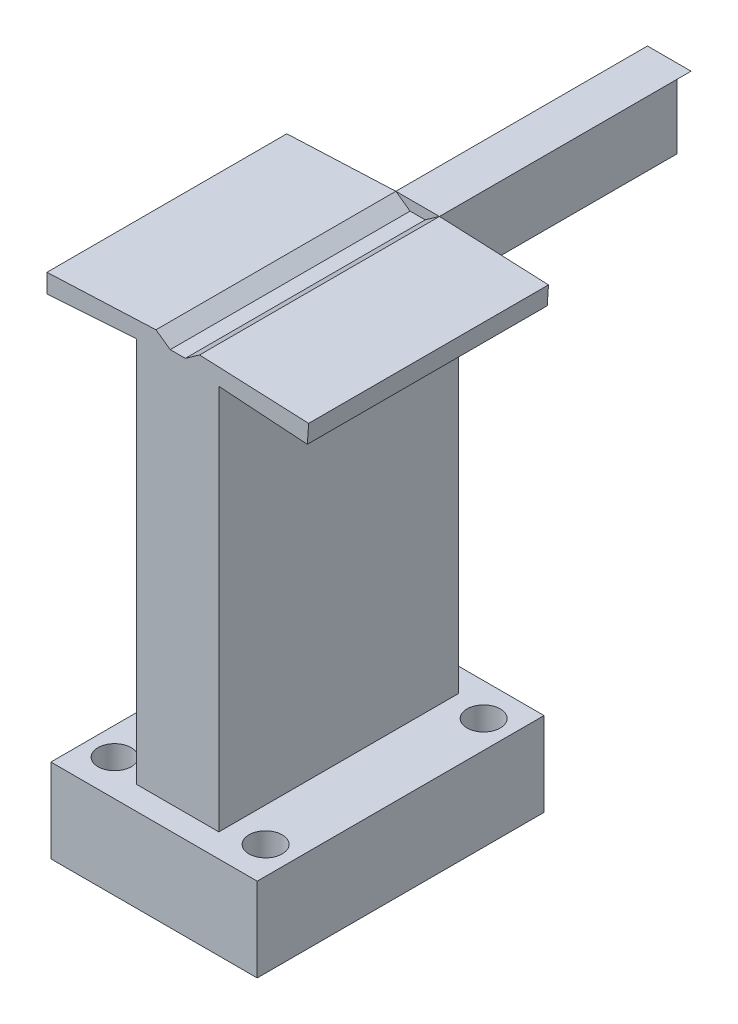
ISO-10303-21;
HEADER;
FILE_DESCRIPTION(('STEP AP214'),'2;1');
FILE_NAME('part.step','',(''),(''),'','','');
FILE_SCHEMA(('AUTOMOTIVE_DESIGN { 1 0 10303 214 1 1 1 1 }'));
ENDSEC;
DATA;
#1=APPLICATION_CONTEXT('core data for automotive mechanical design processes');
#2=APPLICATION_PROTOCOL_DEFINITION('international standard','automotive_design',2000,#1);
#3=PRODUCT_CONTEXT('',#1,'mechanical');
#4=PRODUCT('Part','Part','',(#3));
#5=PRODUCT_RELATED_PRODUCT_CATEGORY('part','',(#4));
#6=PRODUCT_DEFINITION_FORMATION('','',#4);
#7=PRODUCT_DEFINITION_CONTEXT('part definition',#1,'design');
#8=PRODUCT_DEFINITION('design','',#6,#7);
#9=PRODUCT_DEFINITION_SHAPE('','',#8);
#10=(LENGTH_UNIT() NAMED_UNIT(*) SI_UNIT(.MILLI.,.METRE.));
#11=(NAMED_UNIT(*) PLANE_ANGLE_UNIT() SI_UNIT($,.RADIAN.));
#12=(NAMED_UNIT(*) SI_UNIT($,.STERADIAN.) SOLID_ANGLE_UNIT());
#13=UNCERTAINTY_MEASURE_WITH_UNIT(LENGTH_MEASURE(1.E-05),#10,'distance_accuracy_value','');
#14=(GEOMETRIC_REPRESENTATION_CONTEXT(3) GLOBAL_UNCERTAINTY_ASSIGNED_CONTEXT((#13)) GLOBAL_UNIT_ASSIGNED_CONTEXT((#10,
#11,#12)) REPRESENTATION_CONTEXT('',''));
#15=CARTESIAN_POINT('',(0.,0.,0.));
#16=DIRECTION('',(0.,0.,1.));
#17=DIRECTION('',(1.,0.,0.));
#18=AXIS2_PLACEMENT_3D('',#15,#16,#17);
#19=CARTESIAN_POINT('',(-2.286,10.414,74.422));
#20=DIRECTION('',(-0.576683197598655,-0.816967863264762,0.));
#21=DIRECTION('',(0.816967863264762,-0.576683197598654,0.));
#22=AXIS2_PLACEMENT_3D('',#19,#20,#21);
#23=PLANE('',#22);
#24=DIRECTION('',(-0.816967863264762,0.576683197598655,0.));
#25=VECTOR('',#24,1.);
#26=CARTESIAN_POINT('',(-2.286,10.414,38.1));
#27=LINE('',#26,#25);
#28=CARTESIAN_POINT('',(-2.286,10.414,38.1));
#29=VERTEX_POINT('',#28);
#30=CARTESIAN_POINT('',(-4.445,11.938,38.1));
#31=VERTEX_POINT('',#30);
#32=EDGE_CURVE('E192',#29,#31,#27,.T.);
#33=ORIENTED_EDGE('',*,*,#32,.T.);
#34=DIRECTION('',(0.,0.,-1.));
#35=VECTOR('',#34,1.);
#36=CARTESIAN_POINT('',(-4.445,11.938,74.422));
#37=LINE('',#36,#35);
#38=CARTESIAN_POINT('',(-4.445,11.938,74.422));
#39=VERTEX_POINT('',#38);
#40=EDGE_CURVE('E12',#39,#31,#37,.T.);
#41=ORIENTED_EDGE('',*,*,#40,.F.);
#42=DIRECTION('',(-0.816967863264762,0.576683197598655,0.));
#43=VECTOR('',#42,1.);
#44=CARTESIAN_POINT('',(-2.286,10.414,74.422));
#45=LINE('',#44,#43);
#46=CARTESIAN_POINT('',(-2.286,10.414,74.422));
#47=VERTEX_POINT('',#46);
#48=EDGE_CURVE('E235',#47,#39,#45,.T.);
#49=ORIENTED_EDGE('',*,*,#48,.F.);
#50=DIRECTION('',(0.,0.,-1.));
#51=VECTOR('',#50,1.);
#52=CARTESIAN_POINT('',(-2.286,10.414,74.422));
#53=LINE('',#52,#51);
#54=EDGE_CURVE('E188',#47,#29,#53,.T.);
#55=ORIENTED_EDGE('',*,*,#54,.T.);
#56=EDGE_LOOP('',(#33,#41,#49,#55));
#57=FACE_BOUND('',#56,.T.);
#58=ADVANCED_FACE('F53',(#57),#23,.F.);
#59=CARTESIAN_POINT('',(-4.445,11.938,74.422));
#60=DIRECTION('',(0.043270298498433,-0.999063402026046,0.));
#61=DIRECTION('',(0.999063402026046,0.043270298498433,0.));
#62=AXIS2_PLACEMENT_3D('',#59,#60,#61);
#63=PLANE('',#62);
#64=DIRECTION('',(-0.999063402026046,-0.043270298498433,0.));
#65=VECTOR('',#64,1.);
#66=CARTESIAN_POINT('',(-4.445,11.938,38.1));
#67=LINE('',#66,#65);
#68=CARTESIAN_POINT('',(-20.955,11.2229376458387,38.1));
#69=VERTEX_POINT('',#68);
#70=EDGE_CURVE('E196',#31,#69,#67,.T.);
#71=ORIENTED_EDGE('',*,*,#70,.T.);
#72=DIRECTION('',(0.,0.,-1.));
#73=VECTOR('',#72,1.);
#74=CARTESIAN_POINT('',(-20.955,11.2229376458387,74.422));
#75=LINE('',#74,#73);
#76=CARTESIAN_POINT('',(-20.955,11.2229376458387,74.422));
#77=VERTEX_POINT('',#76);
#78=EDGE_CURVE('E63',#77,#69,#75,.T.);
#79=ORIENTED_EDGE('',*,*,#78,.F.);
#80=DIRECTION('',(-0.999063402026046,-0.043270298498433,0.));
#81=VECTOR('',#80,1.);
#82=CARTESIAN_POINT('',(-4.445,11.938,74.422));
#83=LINE('',#82,#81);
#84=EDGE_CURVE('E131',#39,#77,#83,.T.);
#85=ORIENTED_EDGE('',*,*,#84,.F.);
#86=ORIENTED_EDGE('',*,*,#40,.T.);
#87=EDGE_LOOP('',(#71,#79,#85,#86));
#88=FACE_BOUND('',#87,.T.);
#89=ADVANCED_FACE('F419',(#88),#63,.F.);
#90=CARTESIAN_POINT('',(-20.955,11.2229376458387,74.422));
#91=DIRECTION('',(1.,0.,0.));
#92=DIRECTION('',(0.,0.,-1.));
#93=AXIS2_PLACEMENT_3D('',#90,#91,#92);
#94=PLANE('',#93);
#95=DIRECTION('',(0.,-1.,0.));
#96=VECTOR('',#95,1.);
#97=CARTESIAN_POINT('',(-20.955,11.2229376458387,38.1));
#98=LINE('',#97,#96);
#99=CARTESIAN_POINT('',(-20.955,8.36935222492145,38.1));
#100=VERTEX_POINT('',#99);
#101=EDGE_CURVE('E200',#69,#100,#98,.T.);
#102=ORIENTED_EDGE('',*,*,#101,.T.);
#103=DIRECTION('',(0.,0.,-1.));
#104=VECTOR('',#103,1.);
#105=CARTESIAN_POINT('',(-20.955,8.36935222492145,74.422));
#106=LINE('',#105,#104);
#107=CARTESIAN_POINT('',(-20.955,8.36935222492145,74.422));
#108=VERTEX_POINT('',#107);
#109=EDGE_CURVE('E269',#108,#100,#106,.T.);
#110=ORIENTED_EDGE('',*,*,#109,.F.);
#111=DIRECTION('',(0.,-1.,0.));
#112=VECTOR('',#111,1.);
#113=CARTESIAN_POINT('',(-20.955,11.2229376458387,74.422));
#114=LINE('',#113,#112);
#115=EDGE_CURVE('E337',#77,#108,#114,.T.);
#116=ORIENTED_EDGE('',*,*,#115,.F.);
#117=ORIENTED_EDGE('',*,*,#78,.T.);
#118=EDGE_LOOP('',(#102,#110,#116,#117));
#119=FACE_BOUND('',#118,.T.);
#120=ADVANCED_FACE('F424',(#119),#94,.F.);
#121=CARTESIAN_POINT('',(-20.955,8.36935222492145,74.422));
#122=DIRECTION('',(-0.0670937474121484,0.997746675794109,0.));
#123=DIRECTION('',(-0.997746675794109,-0.0670937474121484,0.));
#124=AXIS2_PLACEMENT_3D('',#121,#122,#123);
#125=PLANE('',#124);
#126=DIRECTION('',(0.997746675794109,0.0670937474121484,0.));
#127=VECTOR('',#126,1.);
#128=CARTESIAN_POINT('',(-20.955,8.36935222492145,38.1));
#129=LINE('',#128,#127);
#130=CARTESIAN_POINT('',(-7.45622925128427,9.27708074656047,38.1));
#131=VERTEX_POINT('',#130);
#132=EDGE_CURVE('E203',#100,#131,#129,.T.);
#133=ORIENTED_EDGE('',*,*,#132,.T.);
#134=DIRECTION('',(0.,0.,-1.));
#135=VECTOR('',#134,1.);
#136=CARTESIAN_POINT('',(-7.45622925128427,9.27708074656047,74.422));
#137=LINE('',#136,#135);
#138=CARTESIAN_POINT('',(-7.45622925128427,9.27708074656047,74.422));
#139=VERTEX_POINT('',#138);
#140=EDGE_CURVE('E265',#139,#131,#137,.T.);
#141=ORIENTED_EDGE('',*,*,#140,.F.);
#142=DIRECTION('',(0.997746675794109,0.0670937474121484,0.));
#143=VECTOR('',#142,1.);
#144=CARTESIAN_POINT('',(-20.955,8.36935222492145,74.422));
#145=LINE('',#144,#143);
#146=EDGE_CURVE('E340',#108,#139,#145,.T.);
#147=ORIENTED_EDGE('',*,*,#146,.F.);
#148=ORIENTED_EDGE('',*,*,#109,.T.);
#149=EDGE_LOOP('',(#133,#141,#147,#148));
#150=FACE_BOUND('',#149,.T.);
#151=ADVANCED_FACE('F440',(#150),#125,.F.);
#152=CARTESIAN_POINT('',(-7.45622925128427,9.27708074656047,74.422));
#153=DIRECTION('',(0.69840315219926,0.715704573827873,0.));
#154=DIRECTION('',(-0.715704573827873,0.69840315219926,0.));
#155=AXIS2_PLACEMENT_3D('',#152,#153,#154);
#156=PLANE('',#155);
#157=DIRECTION('',(0.715704573827873,-0.69840315219926,0.));
#158=VECTOR('',#157,1.);
#159=CARTESIAN_POINT('',(-7.45622925128427,9.27708074656047,38.1));
#160=LINE('',#159,#158);
#161=CARTESIAN_POINT('',(-7.366,9.18903269458215,38.1));
#162=VERTEX_POINT('',#161);
#163=EDGE_CURVE('E206',#131,#162,#160,.T.);
#164=ORIENTED_EDGE('',*,*,#163,.T.);
#165=DIRECTION('',(0.,0.,-1.));
#166=VECTOR('',#165,1.);
#167=CARTESIAN_POINT('',(-7.366,9.18903269458215,74.422));
#168=LINE('',#167,#166);
#169=CARTESIAN_POINT('',(-7.366,9.18903269458215,74.422));
#170=VERTEX_POINT('',#169);
#171=EDGE_CURVE('E261',#170,#162,#168,.T.);
#172=ORIENTED_EDGE('',*,*,#171,.F.);
#173=DIRECTION('',(0.715704573827873,-0.69840315219926,0.));
#174=VECTOR('',#173,1.);
#175=CARTESIAN_POINT('',(-7.45622925128427,9.27708074656047,74.422));
#176=LINE('',#175,#174);
#177=EDGE_CURVE('E343',#139,#170,#176,.T.);
#178=ORIENTED_EDGE('',*,*,#177,.F.);
#179=ORIENTED_EDGE('',*,*,#140,.T.);
#180=EDGE_LOOP('',(#164,#172,#178,#179));
#181=FACE_BOUND('',#180,.T.);
#182=ADVANCED_FACE('F443',(#181),#156,.F.);
#183=CARTESIAN_POINT('',(-7.366,-49.1429192534395,74.422));
#184=DIRECTION('',(1.,0.,0.));
#185=DIRECTION('',(0.,0.,-1.));
#186=AXIS2_PLACEMENT_3D('',#183,#184,#185);
#187=PLANE('',#186);
#188=DIRECTION('',(0.,-1.,0.));
#189=VECTOR('',#188,1.);
#190=CARTESIAN_POINT('',(-7.366,-49.1429192534395,38.1));
#191=LINE('',#190,#189);
#192=CARTESIAN_POINT('',(-7.366,-49.1429192534395,38.1));
#193=VERTEX_POINT('',#192);
#194=EDGE_CURVE('E209',#162,#193,#191,.T.);
#195=ORIENTED_EDGE('',*,*,#194,.T.);
#196=DIRECTION('',(0.,0.,-1.));
#197=VECTOR('',#196,1.);
#198=CARTESIAN_POINT('',(-7.366,-49.1429192534395,74.422));
#199=LINE('',#198,#197);
#200=CARTESIAN_POINT('',(-7.366,-49.1429192534395,74.422));
#201=VERTEX_POINT('',#200);
#202=EDGE_CURVE('E257',#201,#193,#199,.T.);
#203=ORIENTED_EDGE('',*,*,#202,.F.);
#204=DIRECTION('',(0.,-1.,0.));
#205=VECTOR('',#204,1.);
#206=CARTESIAN_POINT('',(-7.366,-49.1429192534395,74.422));
#207=LINE('',#206,#205);
#208=EDGE_CURVE('E346',#170,#201,#207,.T.);
#209=ORIENTED_EDGE('',*,*,#208,.F.);
#210=ORIENTED_EDGE('',*,*,#171,.T.);
#211=EDGE_LOOP('',(#195,#203,#209,#210));
#212=FACE_BOUND('',#211,.T.);
#213=ADVANCED_FACE('F448',(#212),#187,.F.);
#214=CARTESIAN_POINT('',(5.08,9.27708074656047,74.422));
#215=DIRECTION('',(-1.,0.,0.));
#216=DIRECTION('',(0.,-1.,0.));
#217=AXIS2_PLACEMENT_3D('',#214,#215,#216);
#218=PLANE('',#217);
#219=DIRECTION('',(0.,1.,0.));
#220=VECTOR('',#219,1.);
#221=CARTESIAN_POINT('',(5.08,9.27708074656047,38.1));
#222=LINE('',#221,#220);
#223=CARTESIAN_POINT('',(5.08000000000001,-49.1429192534395,38.1));
#224=VERTEX_POINT('',#223);
#225=CARTESIAN_POINT('',(5.08,9.27708074656047,38.1));
#226=VERTEX_POINT('',#225);
#227=EDGE_CURVE('E217',#224,#226,#222,.T.);
#228=ORIENTED_EDGE('',*,*,#227,.T.);
#229=DIRECTION('',(0.,0.,-1.));
#230=VECTOR('',#229,1.);
#231=CARTESIAN_POINT('',(5.08,9.27708074656047,74.422));
#232=LINE('',#231,#230);
#233=CARTESIAN_POINT('',(5.08,9.27708074656047,74.422));
#234=VERTEX_POINT('',#233);
#235=EDGE_CURVE('E250',#234,#226,#232,.T.);
#236=ORIENTED_EDGE('',*,*,#235,.F.);
#237=DIRECTION('',(0.,1.,0.));
#238=VECTOR('',#237,1.);
#239=CARTESIAN_POINT('',(5.08,9.27708074656047,74.422));
#240=LINE('',#239,#238);
#241=CARTESIAN_POINT('',(5.08000000000001,-49.1429192534395,74.422));
#242=VERTEX_POINT('',#241);
#243=EDGE_CURVE('E352',#242,#234,#240,.T.);
#244=ORIENTED_EDGE('',*,*,#243,.F.);
#245=DIRECTION('',(0.,0.,-1.));
#246=VECTOR('',#245,1.);
#247=CARTESIAN_POINT('',(5.08000000000001,-49.1429192534395,74.422));
#248=LINE('',#247,#246);
#249=EDGE_CURVE('E254',#242,#224,#248,.T.);
#250=ORIENTED_EDGE('',*,*,#249,.T.);
#251=EDGE_LOOP('',(#228,#236,#244,#250));
#252=FACE_BOUND('',#251,.T.);
#253=ADVANCED_FACE('F455',(#252),#218,.F.);
#254=CARTESIAN_POINT('',(5.17022925128428,9.27708074656047,74.422));
#255=DIRECTION('',(0.,1.,0.));
#256=DIRECTION('',(-1.,0.,0.));
#257=AXIS2_PLACEMENT_3D('',#254,#255,#256);
#258=PLANE('',#257);
#259=DIRECTION('',(1.,0.,0.));
#260=VECTOR('',#259,1.);
#261=CARTESIAN_POINT('',(5.17022925128428,9.27708074656047,38.1));
#262=LINE('',#261,#260);
#263=CARTESIAN_POINT('',(5.17022925128428,9.27708074656047,38.1));
#264=VERTEX_POINT('',#263);
#265=EDGE_CURVE('E220',#226,#264,#262,.T.);
#266=ORIENTED_EDGE('',*,*,#265,.T.);
#267=DIRECTION('',(0.,0.,-1.));
#268=VECTOR('',#267,1.);
#269=CARTESIAN_POINT('',(5.17022925128428,9.27708074656047,74.422));
#270=LINE('',#269,#268);
#271=CARTESIAN_POINT('',(5.17022925128428,9.27708074656047,74.422));
#272=VERTEX_POINT('',#271);
#273=EDGE_CURVE('E246',#272,#264,#270,.T.);
#274=ORIENTED_EDGE('',*,*,#273,.F.);
#275=DIRECTION('',(1.,0.,0.));
#276=VECTOR('',#275,1.);
#277=CARTESIAN_POINT('',(5.17022925128428,9.27708074656047,74.422));
#278=LINE('',#277,#276);
#279=EDGE_CURVE('E355',#234,#272,#278,.T.);
#280=ORIENTED_EDGE('',*,*,#279,.F.);
#281=ORIENTED_EDGE('',*,*,#235,.T.);
#282=EDGE_LOOP('',(#266,#274,#280,#281));
#283=FACE_BOUND('',#282,.T.);
#284=ADVANCED_FACE('F515',(#283),#258,.F.);
#285=CARTESIAN_POINT('',(18.4779736769087,8.38219784213224,74.422));
#286=DIRECTION('',(0.0670937474121468,0.997746675794109,0.));
#287=DIRECTION('',(-0.997746675794109,0.0670937474121468,0.));
#288=AXIS2_PLACEMENT_3D('',#285,#286,#287);
#289=PLANE('',#288);
#290=DIRECTION('',(0.997746675794109,-0.0670937474121467,0.));
#291=VECTOR('',#290,1.);
#292=CARTESIAN_POINT('',(18.4779736769087,8.38219784213224,38.1));
#293=LINE('',#292,#291);
#294=CARTESIAN_POINT('',(18.4779736769087,8.38219784213224,38.1));
#295=VERTEX_POINT('',#294);
#296=EDGE_CURVE('E223',#264,#295,#293,.T.);
#297=ORIENTED_EDGE('',*,*,#296,.T.);
#298=DIRECTION('',(0.,0.,-1.));
#299=VECTOR('',#298,1.);
#300=CARTESIAN_POINT('',(18.4779736769087,8.38219784213224,74.422));
#301=LINE('',#300,#299);
#302=CARTESIAN_POINT('',(18.4779736769087,8.38219784213224,74.422));
#303=VERTEX_POINT('',#302);
#304=EDGE_CURVE('E242',#303,#295,#301,.T.);
#305=ORIENTED_EDGE('',*,*,#304,.F.);
#306=DIRECTION('',(0.997746675794109,-0.0670937474121467,0.));
#307=VECTOR('',#306,1.);
#308=CARTESIAN_POINT('',(18.4779736769087,8.38219784213224,74.422));
#309=LINE('',#308,#307);
#310=EDGE_CURVE('E358',#272,#303,#309,.T.);
#311=ORIENTED_EDGE('',*,*,#310,.F.);
#312=ORIENTED_EDGE('',*,*,#273,.T.);
#313=EDGE_LOOP('',(#297,#305,#311,#312));
#314=FACE_BOUND('',#313,.T.);
#315=ADVANCED_FACE('F511',(#314),#289,.F.);
#316=CARTESIAN_POINT('',(18.669,11.2229376458387,74.422));
#317=DIRECTION('',(-0.997746675794109,0.0670937474121471,0.));
#318=DIRECTION('',(-0.0670937474121471,-0.997746675794109,0.));
#319=AXIS2_PLACEMENT_3D('',#316,#317,#318);
#320=PLANE('',#319);
#321=DIRECTION('',(0.0670937474121471,0.997746675794109,0.));
#322=VECTOR('',#321,1.);
#323=CARTESIAN_POINT('',(18.669,11.2229376458387,38.1));
#324=LINE('',#323,#322);
#325=CARTESIAN_POINT('',(18.669,11.2229376458387,38.1));
#326=VERTEX_POINT('',#325);
#327=EDGE_CURVE('E226',#295,#326,#324,.T.);
#328=ORIENTED_EDGE('',*,*,#327,.T.);
#329=DIRECTION('',(0.,0.,-1.));
#330=VECTOR('',#329,1.);
#331=CARTESIAN_POINT('',(18.669,11.2229376458387,74.422));
#332=LINE('',#331,#330);
#333=CARTESIAN_POINT('',(18.669,11.2229376458387,74.422));
#334=VERTEX_POINT('',#333);
#335=EDGE_CURVE('E181',#334,#326,#332,.T.);
#336=ORIENTED_EDGE('',*,*,#335,.F.);
#337=DIRECTION('',(0.0670937474121471,0.997746675794109,0.));
#338=VECTOR('',#337,1.);
#339=CARTESIAN_POINT('',(18.669,11.2229376458387,74.422));
#340=LINE('',#339,#338);
#341=EDGE_CURVE('E170',#303,#334,#340,.T.);
#342=ORIENTED_EDGE('',*,*,#341,.F.);
#343=ORIENTED_EDGE('',*,*,#304,.T.);
#344=EDGE_LOOP('',(#328,#336,#342,#343));
#345=FACE_BOUND('',#344,.T.);
#346=ADVANCED_FACE('F508',(#345),#320,.F.);
#347=CARTESIAN_POINT('',(2.159,11.938,74.422));
#348=DIRECTION('',(-0.0432702984984311,-0.999063402026046,0.));
#349=DIRECTION('',(0.999063402026046,-0.0432702984984311,0.));
#350=AXIS2_PLACEMENT_3D('',#347,#348,#349);
#351=PLANE('',#350);
#352=DIRECTION('',(-0.999063402026046,0.0432702984984311,0.));
#353=VECTOR('',#352,1.);
#354=CARTESIAN_POINT('',(2.159,11.938,38.1));
#355=LINE('',#354,#353);
#356=CARTESIAN_POINT('',(2.159,11.938,38.1));
#357=VERTEX_POINT('',#356);
#358=EDGE_CURVE('E179',#326,#357,#355,.T.);
#359=ORIENTED_EDGE('',*,*,#358,.T.);
#360=DIRECTION('',(0.,0.,-1.));
#361=VECTOR('',#360,1.);
#362=CARTESIAN_POINT('',(2.159,11.938,74.422));
#363=LINE('',#362,#361);
#364=CARTESIAN_POINT('',(2.159,11.938,74.422));
#365=VERTEX_POINT('',#364);
#366=EDGE_CURVE('E176',#365,#357,#363,.T.);
#367=ORIENTED_EDGE('',*,*,#366,.F.);
#368=DIRECTION('',(-0.999063402026046,0.0432702984984311,0.));
#369=VECTOR('',#368,1.);
#370=CARTESIAN_POINT('',(2.159,11.938,74.422));
#371=LINE('',#370,#369);
#372=EDGE_CURVE('E164',#334,#365,#371,.T.);
#373=ORIENTED_EDGE('',*,*,#372,.F.);
#374=ORIENTED_EDGE('',*,*,#335,.T.);
#375=EDGE_LOOP('',(#359,#367,#373,#374));
#376=FACE_BOUND('',#375,.T.);
#377=ADVANCED_FACE('F177',(#376),#351,.F.);
#378=CARTESIAN_POINT('',(0.,10.414,74.422));
#379=DIRECTION('',(0.576683197598655,-0.816967863264762,0.));
#380=DIRECTION('',(0.816967863264762,0.576683197598655,0.));
#381=AXIS2_PLACEMENT_3D('',#378,#379,#380);
#382=PLANE('',#381);
#383=DIRECTION('',(-0.816967863264762,-0.576683197598655,0.));
#384=VECTOR('',#383,1.);
#385=CARTESIAN_POINT('',(0.,10.414,38.1));
#386=LINE('',#385,#384);
#387=CARTESIAN_POINT('',(0.,10.414,38.1));
#388=VERTEX_POINT('',#387);
#389=EDGE_CURVE('E117',#357,#388,#386,.T.);
#390=ORIENTED_EDGE('',*,*,#389,.T.);
#391=DIRECTION('',(0.,0.,-1.));
#392=VECTOR('',#391,1.);
#393=CARTESIAN_POINT('',(0.,10.414,74.422));
#394=LINE('',#393,#392);
#395=CARTESIAN_POINT('',(0.,10.414,74.422));
#396=VERTEX_POINT('',#395);
#397=EDGE_CURVE('E182',#396,#388,#394,.T.);
#398=ORIENTED_EDGE('',*,*,#397,.F.);
#399=DIRECTION('',(-0.816967863264762,-0.576683197598655,0.));
#400=VECTOR('',#399,1.);
#401=CARTESIAN_POINT('',(0.,10.414,74.422));
#402=LINE('',#401,#400);
#403=EDGE_CURVE('E168',#365,#396,#402,.T.);
#404=ORIENTED_EDGE('',*,*,#403,.F.);
#405=ORIENTED_EDGE('',*,*,#366,.T.);
#406=EDGE_LOOP('',(#390,#398,#404,#405));
#407=FACE_BOUND('',#406,.T.);
#408=ADVANCED_FACE('F184',(#407),#382,.F.);
#409=CARTESIAN_POINT('',(-2.286,10.414,74.422));
#410=DIRECTION('',(0.,-1.,0.));
#411=DIRECTION('',(0.,0.,-1.));
#412=AXIS2_PLACEMENT_3D('',#409,#410,#411);
#413=PLANE('',#412);
#414=DIRECTION('',(-1.,0.,0.));
#415=VECTOR('',#414,1.);
#416=CARTESIAN_POINT('',(-2.286,10.414,38.1));
#417=LINE('',#416,#415);
#418=EDGE_CURVE('E123',#388,#29,#417,.T.);
#419=ORIENTED_EDGE('',*,*,#418,.T.);
#420=ORIENTED_EDGE('',*,*,#54,.F.);
#421=DIRECTION('',(-1.,0.,0.));
#422=VECTOR('',#421,1.);
#423=CARTESIAN_POINT('',(-2.286,10.414,74.422));
#424=LINE('',#423,#422);
#425=EDGE_CURVE('E72',#396,#47,#424,.T.);
#426=ORIENTED_EDGE('',*,*,#425,.F.);
#427=ORIENTED_EDGE('',*,*,#397,.T.);
#428=EDGE_LOOP('',(#419,#420,#426,#427));
#429=FACE_BOUND('',#428,.T.);
#430=ADVANCED_FACE('F500',(#429),#413,.F.);
#431=CARTESIAN_POINT('',(0.,0.,74.422));
#432=DIRECTION('',(0.,0.,-1.));
#433=DIRECTION('',(-1.,0.,0.));
#434=AXIS2_PLACEMENT_3D('',#431,#432,#433);
#435=PLANE('',#434);
#436=ORIENTED_EDGE('',*,*,#48,.T.);
#437=ORIENTED_EDGE('',*,*,#84,.T.);
#438=ORIENTED_EDGE('',*,*,#115,.T.);
#439=ORIENTED_EDGE('',*,*,#146,.T.);
#440=ORIENTED_EDGE('',*,*,#177,.T.);
#441=ORIENTED_EDGE('',*,*,#208,.T.);
#442=DIRECTION('',(1.,0.,0.));
#443=VECTOR('',#442,1.);
#444=CARTESIAN_POINT('',(-7.366,-49.1429192534395,74.422));
#445=LINE('',#444,#443);
#446=EDGE_CURVE('E349',#201,#242,#445,.T.);
#447=ORIENTED_EDGE('',*,*,#446,.T.);
#448=ORIENTED_EDGE('',*,*,#243,.T.);
#449=ORIENTED_EDGE('',*,*,#279,.T.);
#450=ORIENTED_EDGE('',*,*,#310,.T.);
#451=ORIENTED_EDGE('',*,*,#341,.T.);
#452=ORIENTED_EDGE('',*,*,#372,.T.);
#453=ORIENTED_EDGE('',*,*,#403,.T.);
#454=ORIENTED_EDGE('',*,*,#425,.T.);
#455=EDGE_LOOP('',(#436,#437,#438,#439,#440,#441,#447,#448,#449,#450,#451,#452,#453,#454));
#456=FACE_BOUND('',#455,.T.);
#457=ADVANCED_FACE('F166',(#456),#435,.F.);
#458=CARTESIAN_POINT('',(0.,0.,38.1));
#459=DIRECTION('',(0.,0.,-1.));
#460=DIRECTION('',(-1.,0.,0.));
#461=AXIS2_PLACEMENT_3D('',#458,#459,#460);
#462=PLANE('',#461);
#463=ORIENTED_EDGE('',*,*,#32,.F.);
#464=ORIENTED_EDGE('',*,*,#418,.F.);
#465=ORIENTED_EDGE('',*,*,#389,.F.);
#466=ORIENTED_EDGE('',*,*,#358,.F.);
#467=ORIENTED_EDGE('',*,*,#327,.F.);
#468=ORIENTED_EDGE('',*,*,#296,.F.);
#469=ORIENTED_EDGE('',*,*,#265,.F.);
#470=ORIENTED_EDGE('',*,*,#227,.F.);
#471=DIRECTION('',(1.,0.,0.));
#472=VECTOR('',#471,1.);
#473=CARTESIAN_POINT('',(-7.366,-49.1429192534395,38.1));
#474=LINE('',#473,#472);
#475=EDGE_CURVE('E213',#193,#224,#474,.T.);
#476=ORIENTED_EDGE('',*,*,#475,.F.);
#477=ORIENTED_EDGE('',*,*,#194,.F.);
#478=ORIENTED_EDGE('',*,*,#163,.F.);
#479=ORIENTED_EDGE('',*,*,#132,.F.);
#480=ORIENTED_EDGE('',*,*,#101,.F.);
#481=ORIENTED_EDGE('',*,*,#70,.F.);
#482=EDGE_LOOP('',(#463,#464,#465,#466,#467,#468,#469,#470,#476,#477,#478,#479,#480,#481));
#483=FACE_BOUND('',#482,.T.);
#484=ADVANCED_FACE('F429',(#483),#462,.T.);
#485=CARTESIAN_POINT('',(-16.8007707487157,-61.8429192534395,34.544));
#486=DIRECTION('',(1.,0.,0.));
#487=DIRECTION('',(0.,0.,-1.));
#488=AXIS2_PLACEMENT_3D('',#485,#486,#487);
#489=PLANE('',#488);
#490=DIRECTION('',(0.,0.,-1.));
#491=VECTOR('',#490,1.);
#492=CARTESIAN_POINT('',(-16.8007707487157,-49.1429192534395,34.544));
#493=LINE('',#492,#491);
#494=CARTESIAN_POINT('',(-16.8007707487157,-49.1429192534395,77.978));
#495=VERTEX_POINT('',#494);
#496=CARTESIAN_POINT('',(-16.8007707487157,-49.1429192534395,34.544));
#497=VERTEX_POINT('',#496);
#498=EDGE_CURVE('E291',#495,#497,#493,.T.);
#499=ORIENTED_EDGE('',*,*,#498,.T.);
#500=DIRECTION('',(0.,1.,0.));
#501=VECTOR('',#500,1.);
#502=CARTESIAN_POINT('',(-16.8007707487157,-61.8429192534395,34.544));
#503=LINE('',#502,#501);
#504=CARTESIAN_POINT('',(-16.8007707487157,-61.8429192534395,34.544));
#505=VERTEX_POINT('',#504);
#506=EDGE_CURVE('E197',#505,#497,#503,.T.);
#507=ORIENTED_EDGE('',*,*,#506,.F.);
#508=DIRECTION('',(0.,0.,-1.));
#509=VECTOR('',#508,1.);
#510=CARTESIAN_POINT('',(-16.8007707487157,-61.8429192534395,34.544));
#511=LINE('',#510,#509);
#512=CARTESIAN_POINT('',(-16.8007707487157,-61.8429192534395,77.978));
#513=VERTEX_POINT('',#512);
#514=EDGE_CURVE('E318',#513,#505,#511,.T.);
#515=ORIENTED_EDGE('',*,*,#514,.F.);
#516=DIRECTION('',(0.,1.,0.));
#517=VECTOR('',#516,1.);
#518=CARTESIAN_POINT('',(-16.8007707487157,-61.8429192534395,77.978));
#519=LINE('',#518,#517);
#520=EDGE_CURVE('E319',#513,#495,#519,.T.);
#521=ORIENTED_EDGE('',*,*,#520,.T.);
#522=EDGE_LOOP('',(#499,#507,#515,#521));
#523=FACE_BOUND('',#522,.T.);
#524=ADVANCED_FACE('F488',(#523),#489,.F.);
#525=CARTESIAN_POINT('',(14.4412292512843,-61.8429192534395,34.544));
#526=DIRECTION('',(0.,0.,1.));
#527=DIRECTION('',(1.,0.,0.));
#528=AXIS2_PLACEMENT_3D('',#525,#526,#527);
#529=PLANE('',#528);
#530=DIRECTION('',(1.,0.,0.));
#531=VECTOR('',#530,1.);
#532=CARTESIAN_POINT('',(14.4412292512843,-49.1429192534395,34.544));
#533=LINE('',#532,#531);
#534=CARTESIAN_POINT('',(14.4412292512843,-49.1429192534395,34.544));
#535=VERTEX_POINT('',#534);
#536=EDGE_CURVE('E296',#497,#535,#533,.T.);
#537=ORIENTED_EDGE('',*,*,#536,.T.);
#538=DIRECTION('',(0.,1.,0.));
#539=VECTOR('',#538,1.);
#540=CARTESIAN_POINT('',(14.4412292512843,-61.8429192534395,34.544));
#541=LINE('',#540,#539);
#542=CARTESIAN_POINT('',(14.4412292512843,-61.8429192534395,34.544));
#543=VERTEX_POINT('',#542);
#544=EDGE_CURVE('E326',#543,#535,#541,.T.);
#545=ORIENTED_EDGE('',*,*,#544,.F.);
#546=DIRECTION('',(1.,0.,0.));
#547=VECTOR('',#546,1.);
#548=CARTESIAN_POINT('',(14.4412292512843,-61.8429192534395,34.544));
#549=LINE('',#548,#547);
#550=EDGE_CURVE('E367',#505,#543,#549,.T.);
#551=ORIENTED_EDGE('',*,*,#550,.F.);
#552=ORIENTED_EDGE('',*,*,#506,.T.);
#553=EDGE_LOOP('',(#537,#545,#551,#552));
#554=FACE_BOUND('',#553,.T.);
#555=ADVANCED_FACE('F484',(#554),#529,.F.);
#556=CARTESIAN_POINT('',(14.4412292512843,-61.8429192534395,77.978));
#557=DIRECTION('',(-1.,0.,0.));
#558=DIRECTION('',(0.,0.,1.));
#559=AXIS2_PLACEMENT_3D('',#556,#557,#558);
#560=PLANE('',#559);
#561=DIRECTION('',(0.,0.,1.));
#562=VECTOR('',#561,1.);
#563=CARTESIAN_POINT('',(14.4412292512843,-49.1429192534395,77.978));
#564=LINE('',#563,#562);
#565=CARTESIAN_POINT('',(14.4412292512843,-49.1429192534395,77.978));
#566=VERTEX_POINT('',#565);
#567=EDGE_CURVE('E305',#535,#566,#564,.T.);
#568=ORIENTED_EDGE('',*,*,#567,.T.);
#569=DIRECTION('',(0.,1.,0.));
#570=VECTOR('',#569,1.);
#571=CARTESIAN_POINT('',(14.4412292512843,-61.8429192534395,77.978));
#572=LINE('',#571,#570);
#573=CARTESIAN_POINT('',(14.4412292512843,-61.8429192534395,77.978));
#574=VERTEX_POINT('',#573);
#575=EDGE_CURVE('E322',#574,#566,#572,.T.);
#576=ORIENTED_EDGE('',*,*,#575,.F.);
#577=DIRECTION('',(0.,0.,1.));
#578=VECTOR('',#577,1.);
#579=CARTESIAN_POINT('',(14.4412292512843,-61.8429192534395,77.978));
#580=LINE('',#579,#578);
#581=EDGE_CURVE('E364',#543,#574,#580,.T.);
#582=ORIENTED_EDGE('',*,*,#581,.F.);
#583=ORIENTED_EDGE('',*,*,#544,.T.);
#584=EDGE_LOOP('',(#568,#576,#582,#583));
#585=FACE_BOUND('',#584,.T.);
#586=ADVANCED_FACE('F487',(#585),#560,.F.);
#587=CARTESIAN_POINT('',(-16.8007707487157,-61.8429192534395,77.978));
#588=DIRECTION('',(0.,0.,-1.));
#589=DIRECTION('',(-1.,0.,0.));
#590=AXIS2_PLACEMENT_3D('',#587,#588,#589);
#591=PLANE('',#590);
#592=DIRECTION('',(-1.,0.,0.));
#593=VECTOR('',#592,1.);
#594=CARTESIAN_POINT('',(-16.8007707487157,-49.1429192534395,77.978));
#595=LINE('',#594,#593);
#596=EDGE_CURVE('E314',#566,#495,#595,.T.);
#597=ORIENTED_EDGE('',*,*,#596,.T.);
#598=ORIENTED_EDGE('',*,*,#520,.F.);
#599=DIRECTION('',(-1.,0.,0.));
#600=VECTOR('',#599,1.);
#601=CARTESIAN_POINT('',(-16.8007707487157,-61.8429192534395,77.978));
#602=LINE('',#601,#600);
#603=EDGE_CURVE('E308',#574,#513,#602,.T.);
#604=ORIENTED_EDGE('',*,*,#603,.F.);
#605=ORIENTED_EDGE('',*,*,#575,.T.);
#606=EDGE_LOOP('',(#597,#598,#604,#605));
#607=FACE_BOUND('',#606,.T.);
#608=ADVANCED_FACE('F399',(#607),#591,.F.);
#609=CARTESIAN_POINT('',(0.,-61.8429192534395,0.));
#610=DIRECTION('',(0.,1.,0.));
#611=DIRECTION('',(0.,0.,1.));
#612=AXIS2_PLACEMENT_3D('',#609,#610,#611);
#613=PLANE('',#612);
#614=CARTESIAN_POINT('',(-12.6097703506109,-61.8429192534395,39.501266304488));
#615=DIRECTION('',(0.,-1.,0.));
#616=DIRECTION('',(0.,0.,-1.));
#617=AXIS2_PLACEMENT_3D('',#614,#615,#616);
#618=CIRCLE('',#617,2.51460000000001);
#619=CARTESIAN_POINT('',(-12.6097703506109,-61.8429192534395,36.9866663044879));
#620=VERTEX_POINT('',#619);
#621=EDGE_CURVE('E381',#620,#620,#618,.T.);
#622=ORIENTED_EDGE('',*,*,#621,.F.);
#623=EDGE_LOOP('',(#622));
#624=FACE_BOUND('',#623,.T.);
#625=CARTESIAN_POINT('',(10.2502292512843,-61.8429192534395,39.501266304488));
#626=DIRECTION('',(0.,-1.,0.));
#627=DIRECTION('',(0.,0.,-1.));
#628=AXIS2_PLACEMENT_3D('',#625,#626,#627);
#629=CIRCLE('',#628,2.51460000000001);
#630=CARTESIAN_POINT('',(10.2502292512843,-61.8429192534395,36.9866663044879));
#631=VERTEX_POINT('',#630);
#632=EDGE_CURVE('E385',#631,#631,#629,.T.);
#633=ORIENTED_EDGE('',*,*,#632,.F.);
#634=EDGE_LOOP('',(#633));
#635=FACE_BOUND('',#634,.T.);
#636=CARTESIAN_POINT('',(10.2502292512843,-61.8429192534395,72.517));
#637=DIRECTION('',(0.,-1.,0.));
#638=DIRECTION('',(0.,0.,-1.));
#639=AXIS2_PLACEMENT_3D('',#636,#637,#638);
#640=CIRCLE('',#639,2.5146);
#641=CARTESIAN_POINT('',(10.2502292512843,-61.8429192534395,70.0024));
#642=VERTEX_POINT('',#641);
#643=EDGE_CURVE('E380',#642,#642,#640,.T.);
#644=ORIENTED_EDGE('',*,*,#643,.F.);
#645=EDGE_LOOP('',(#644));
#646=FACE_BOUND('',#645,.T.);
#647=CARTESIAN_POINT('',(-12.6097703506109,-61.8429192534395,72.517));
#648=DIRECTION('',(0.,-1.,0.));
#649=DIRECTION('',(0.,0.,-1.));
#650=AXIS2_PLACEMENT_3D('',#647,#648,#649);
#651=CIRCLE('',#650,2.51459999999999);
#652=CARTESIAN_POINT('',(-12.6097703506109,-61.8429192534395,70.0024));
#653=VERTEX_POINT('',#652);
#654=EDGE_CURVE('E281',#653,#653,#651,.T.);
#655=ORIENTED_EDGE('',*,*,#654,.F.);
#656=EDGE_LOOP('',(#655));
#657=FACE_BOUND('',#656,.T.);
#658=ORIENTED_EDGE('',*,*,#514,.T.);
#659=ORIENTED_EDGE('',*,*,#550,.T.);
#660=ORIENTED_EDGE('',*,*,#581,.T.);
#661=ORIENTED_EDGE('',*,*,#603,.T.);
#662=EDGE_LOOP('',(#658,#659,#660,#661));
#663=FACE_BOUND('',#662,.T.);
#664=ADVANCED_FACE('F395',(#624,#635,#646,#657,#663),#613,.F.);
#665=CARTESIAN_POINT('',(0.,-49.1429192534395,0.));
#666=DIRECTION('',(0.,1.,0.));
#667=DIRECTION('',(0.,0.,1.));
#668=AXIS2_PLACEMENT_3D('',#665,#666,#667);
#669=PLANE('',#668);
#670=CARTESIAN_POINT('',(-12.6097703506109,-49.1429192534395,39.501266304488));
#671=DIRECTION('',(0.,1.,0.));
#672=DIRECTION('',(0.,0.,1.));
#673=AXIS2_PLACEMENT_3D('',#670,#671,#672);
#674=CIRCLE('',#673,2.51460000000001);
#675=CARTESIAN_POINT('',(-12.6097703506109,-49.1429192534395,42.015866304488));
#676=VERTEX_POINT('',#675);
#677=EDGE_CURVE('E56',#676,#676,#674,.T.);
#678=ORIENTED_EDGE('',*,*,#677,.F.);
#679=EDGE_LOOP('',(#678));
#680=FACE_BOUND('',#679,.T.);
#681=CARTESIAN_POINT('',(10.2502292512843,-49.1429192534395,39.501266304488));
#682=DIRECTION('',(0.,1.,0.));
#683=DIRECTION('',(0.,0.,1.));
#684=AXIS2_PLACEMENT_3D('',#681,#682,#683);
#685=CIRCLE('',#684,2.51460000000001);
#686=CARTESIAN_POINT('',(10.2502292512843,-49.1429192534395,42.015866304488));
#687=VERTEX_POINT('',#686);
#688=EDGE_CURVE('E284',#687,#687,#685,.T.);
#689=ORIENTED_EDGE('',*,*,#688,.F.);
#690=EDGE_LOOP('',(#689));
#691=FACE_BOUND('',#690,.T.);
#692=CARTESIAN_POINT('',(10.2502292512843,-49.1429192534395,72.517));
#693=DIRECTION('',(0.,1.,0.));
#694=DIRECTION('',(0.,0.,1.));
#695=AXIS2_PLACEMENT_3D('',#692,#693,#694);
#696=CIRCLE('',#695,2.5146);
#697=CARTESIAN_POINT('',(10.2502292512843,-49.1429192534395,75.0316));
#698=VERTEX_POINT('',#697);
#699=EDGE_CURVE('E280',#698,#698,#696,.T.);
#700=ORIENTED_EDGE('',*,*,#699,.F.);
#701=EDGE_LOOP('',(#700));
#702=FACE_BOUND('',#701,.T.);
#703=CARTESIAN_POINT('',(-12.6097703506109,-49.1429192534395,72.517));
#704=DIRECTION('',(0.,1.,0.));
#705=DIRECTION('',(0.,0.,1.));
#706=AXIS2_PLACEMENT_3D('',#703,#704,#705);
#707=CIRCLE('',#706,2.51459999999999);
#708=CARTESIAN_POINT('',(-12.6097703506109,-49.1429192534395,75.0316));
#709=VERTEX_POINT('',#708);
#710=EDGE_CURVE('E276',#709,#709,#707,.T.);
#711=ORIENTED_EDGE('',*,*,#710,.F.);
#712=EDGE_LOOP('',(#711));
#713=FACE_BOUND('',#712,.T.);
#714=ORIENTED_EDGE('',*,*,#202,.T.);
#715=ORIENTED_EDGE('',*,*,#475,.T.);
#716=ORIENTED_EDGE('',*,*,#249,.F.);
#717=ORIENTED_EDGE('',*,*,#446,.F.);
#718=EDGE_LOOP('',(#714,#715,#716,#717));
#719=FACE_BOUND('',#718,.T.);
#720=ORIENTED_EDGE('',*,*,#498,.F.);
#721=ORIENTED_EDGE('',*,*,#596,.F.);
#722=ORIENTED_EDGE('',*,*,#567,.F.);
#723=ORIENTED_EDGE('',*,*,#536,.F.);
#724=EDGE_LOOP('',(#720,#721,#722,#723));
#725=FACE_BOUND('',#724,.T.);
#726=ADVANCED_FACE('F398',(#680,#691,#702,#713,#719,#725),#669,.T.);
#727=CARTESIAN_POINT('',(-12.6097703506109,-47.8729192534395,72.517));
#728=DIRECTION('',(0.,-1.,0.));
#729=DIRECTION('',(0.,0.,-1.));
#730=AXIS2_PLACEMENT_3D('',#727,#728,#729);
#731=CYLINDRICAL_SURFACE('',#730,2.51459999999999);
#732=ORIENTED_EDGE('',*,*,#710,.T.);
#733=EDGE_LOOP('',(#732));
#734=FACE_BOUND('',#733,.T.);
#735=ORIENTED_EDGE('',*,*,#654,.T.);
#736=EDGE_LOOP('',(#735));
#737=FACE_BOUND('',#736,.T.);
#738=ADVANCED_FACE('F404',(#734,#737),#731,.F.);
#739=CARTESIAN_POINT('',(10.2502292512843,-47.8729192534395,72.517));
#740=DIRECTION('',(0.,-1.,0.));
#741=DIRECTION('',(0.,0.,-1.));
#742=AXIS2_PLACEMENT_3D('',#739,#740,#741);
#743=CYLINDRICAL_SURFACE('',#742,2.5146);
#744=ORIENTED_EDGE('',*,*,#699,.T.);
#745=EDGE_LOOP('',(#744));
#746=FACE_BOUND('',#745,.T.);
#747=ORIENTED_EDGE('',*,*,#643,.T.);
#748=EDGE_LOOP('',(#747));
#749=FACE_BOUND('',#748,.T.);
#750=ADVANCED_FACE('F393',(#746,#749),#743,.F.);
#751=CARTESIAN_POINT('',(10.2502292512843,-47.8729192534395,39.501266304488));
#752=DIRECTION('',(0.,-1.,0.));
#753=DIRECTION('',(0.,0.,-1.));
#754=AXIS2_PLACEMENT_3D('',#751,#752,#753);
#755=CYLINDRICAL_SURFACE('',#754,2.51460000000001);
#756=ORIENTED_EDGE('',*,*,#688,.T.);
#757=EDGE_LOOP('',(#756));
#758=FACE_BOUND('',#757,.T.);
#759=ORIENTED_EDGE('',*,*,#632,.T.);
#760=EDGE_LOOP('',(#759));
#761=FACE_BOUND('',#760,.T.);
#762=ADVANCED_FACE('F412',(#758,#761),#755,.F.);
#763=CARTESIAN_POINT('',(-12.6097703506109,-47.8729192534395,39.501266304488));
#764=DIRECTION('',(0.,-1.,0.));
#765=DIRECTION('',(0.,0.,-1.));
#766=AXIS2_PLACEMENT_3D('',#763,#764,#765);
#767=CYLINDRICAL_SURFACE('',#766,2.51460000000001);
#768=ORIENTED_EDGE('',*,*,#677,.T.);
#769=EDGE_LOOP('',(#768));
#770=FACE_BOUND('',#769,.T.);
#771=ORIENTED_EDGE('',*,*,#621,.T.);
#772=EDGE_LOOP('',(#771));
#773=FACE_BOUND('',#772,.T.);
#774=ADVANCED_FACE('F646',(#770,#773),#767,.F.);
#775=CLOSED_SHELL('',(#58,#89,#120,#151,#182,#213,#253,#284,#315,#346,#377,#408,#430,#457,#484,
#524,#555,#586,#608,#664,#726,#738,#750,#762,#774));
#776=MANIFOLD_SOLID_BREP('B2',#775);
#777=CARTESIAN_POINT('',(-2.286,0.,38.1));
#778=DIRECTION('',(0.,1.,0.));
#779=DIRECTION('',(0.,0.,1.));
#780=AXIS2_PLACEMENT_3D('',#777,#778,#779);
#781=PLANE('',#780);
#782=DIRECTION('',(1.,0.,0.));
#783=VECTOR('',#782,1.);
#784=CARTESIAN_POINT('',(-2.286,0.,0.));
#785=LINE('',#784,#783);
#786=CARTESIAN_POINT('',(-2.286,0.,0.));
#787=VERTEX_POINT('',#786);
#788=CARTESIAN_POINT('',(0.,0.,0.));
#789=VERTEX_POINT('',#788);
#790=EDGE_CURVE('E838',#787,#789,#785,.T.);
#791=ORIENTED_EDGE('',*,*,#790,.T.);
#792=DIRECTION('',(0.,0.,-1.));
#793=VECTOR('',#792,1.);
#794=CARTESIAN_POINT('',(0.,0.,38.1));
#795=LINE('',#794,#793);
#796=CARTESIAN_POINT('',(0.,0.,38.1));
#797=VERTEX_POINT('',#796);
#798=EDGE_CURVE('E51',#797,#789,#795,.T.);
#799=ORIENTED_EDGE('',*,*,#798,.F.);
#800=DIRECTION('',(1.,0.,0.));
#801=VECTOR('',#800,1.);
#802=CARTESIAN_POINT('',(-2.286,0.,38.1));
#803=LINE('',#802,#801);
#804=CARTESIAN_POINT('',(-2.286,0.,38.1));
#805=VERTEX_POINT('',#804);
#806=EDGE_CURVE('E848',#805,#797,#803,.T.);
#807=ORIENTED_EDGE('',*,*,#806,.F.);
#808=DIRECTION('',(0.,0.,-1.));
#809=VECTOR('',#808,1.);
#810=CARTESIAN_POINT('',(-2.286,0.,38.1));
#811=LINE('',#810,#809);
#812=EDGE_CURVE('E834',#805,#787,#811,.T.);
#813=ORIENTED_EDGE('',*,*,#812,.T.);
#814=EDGE_LOOP('',(#791,#799,#807,#813));
#815=FACE_BOUND('',#814,.T.);
#816=ADVANCED_FACE('F754',(#815),#781,.F.);
#817=CARTESIAN_POINT('',(0.,0.,38.1));
#818=DIRECTION('',(-1.,0.,0.));
#819=DIRECTION('',(0.,0.,1.));
#820=AXIS2_PLACEMENT_3D('',#817,#818,#819);
#821=PLANE('',#820);
#822=DIRECTION('',(0.,1.,0.));
#823=VECTOR('',#822,1.);
#824=CARTESIAN_POINT('',(0.,0.,0.));
#825=LINE('',#824,#823);
#826=CARTESIAN_POINT('',(0.,10.414,0.));
#827=VERTEX_POINT('',#826);
#828=EDGE_CURVE('E841',#789,#827,#825,.T.);
#829=ORIENTED_EDGE('',*,*,#828,.T.);
#830=DIRECTION('',(0.,0.,-1.));
#831=VECTOR('',#830,1.);
#832=CARTESIAN_POINT('',(0.,10.414,38.1));
#833=LINE('',#832,#831);
#834=CARTESIAN_POINT('',(0.,10.414,38.1));
#835=VERTEX_POINT('',#834);
#836=EDGE_CURVE('E762',#835,#827,#833,.T.);
#837=ORIENTED_EDGE('',*,*,#836,.F.);
#838=DIRECTION('',(0.,1.,0.));
#839=VECTOR('',#838,1.);
#840=CARTESIAN_POINT('',(0.,0.,38.1));
#841=LINE('',#840,#839);
#842=EDGE_CURVE('E807',#797,#835,#841,.T.);
#843=ORIENTED_EDGE('',*,*,#842,.F.);
#844=ORIENTED_EDGE('',*,*,#798,.T.);
#845=EDGE_LOOP('',(#829,#837,#843,#844));
#846=FACE_BOUND('',#845,.T.);
#847=ADVANCED_FACE('F872',(#846),#821,.F.);
#848=CARTESIAN_POINT('',(0.,10.414,38.1));
#849=DIRECTION('',(-0.576683197598655,0.816967863264762,0.));
#850=DIRECTION('',(-0.816967863264762,-0.576683197598655,0.));
#851=AXIS2_PLACEMENT_3D('',#848,#849,#850);
#852=PLANE('',#851);
#853=DIRECTION('',(0.816967863264762,0.576683197598655,0.));
#854=VECTOR('',#853,1.);
#855=CARTESIAN_POINT('',(0.,10.414,0.));
#856=LINE('',#855,#854);
#857=CARTESIAN_POINT('',(2.159,11.938,0.));
#858=VERTEX_POINT('',#857);
#859=EDGE_CURVE('E843',#827,#858,#856,.T.);
#860=ORIENTED_EDGE('',*,*,#859,.T.);
#861=DIRECTION('',(0.,0.,-1.));
#862=VECTOR('',#861,1.);
#863=CARTESIAN_POINT('',(2.159,11.938,38.1));
#864=LINE('',#863,#862);
#865=CARTESIAN_POINT('',(2.159,11.938,38.1));
#866=VERTEX_POINT('',#865);
#867=EDGE_CURVE('E829',#866,#858,#864,.T.);
#868=ORIENTED_EDGE('',*,*,#867,.F.);
#869=DIRECTION('',(0.816967863264762,0.576683197598655,0.));
#870=VECTOR('',#869,1.);
#871=CARTESIAN_POINT('',(0.,10.414,38.1));
#872=LINE('',#871,#870);
#873=EDGE_CURVE('E820',#835,#866,#872,.T.);
#874=ORIENTED_EDGE('',*,*,#873,.F.);
#875=ORIENTED_EDGE('',*,*,#836,.T.);
#876=EDGE_LOOP('',(#860,#868,#874,#875));
#877=FACE_BOUND('',#876,.T.);
#878=ADVANCED_FACE('F854',(#877),#852,.F.);
#879=CARTESIAN_POINT('',(2.159,11.938,38.1));
#880=DIRECTION('',(0.,-1.,0.));
#881=DIRECTION('',(0.,0.,-1.));
#882=AXIS2_PLACEMENT_3D('',#879,#880,#881);
#883=PLANE('',#882);
#884=DIRECTION('',(-1.,0.,0.));
#885=VECTOR('',#884,1.);
#886=CARTESIAN_POINT('',(2.159,11.938,0.));
#887=LINE('',#886,#885);
#888=CARTESIAN_POINT('',(-4.445,11.938,0.));
#889=VERTEX_POINT('',#888);
#890=EDGE_CURVE('E828',#858,#889,#887,.T.);
#891=ORIENTED_EDGE('',*,*,#890,.T.);
#892=DIRECTION('',(0.,0.,-1.));
#893=VECTOR('',#892,1.);
#894=CARTESIAN_POINT('',(-4.445,11.938,38.1));
#895=LINE('',#894,#893);
#896=CARTESIAN_POINT('',(-4.445,11.938,38.1));
#897=VERTEX_POINT('',#896);
#898=EDGE_CURVE('E825',#897,#889,#895,.T.);
#899=ORIENTED_EDGE('',*,*,#898,.F.);
#900=DIRECTION('',(-1.,0.,0.));
#901=VECTOR('',#900,1.);
#902=CARTESIAN_POINT('',(2.159,11.938,38.1));
#903=LINE('',#902,#901);
#904=EDGE_CURVE('E814',#866,#897,#903,.T.);
#905=ORIENTED_EDGE('',*,*,#904,.F.);
#906=ORIENTED_EDGE('',*,*,#867,.T.);
#907=EDGE_LOOP('',(#891,#899,#905,#906));
#908=FACE_BOUND('',#907,.T.);
#909=ADVANCED_FACE('F826',(#908),#883,.F.);
#910=CARTESIAN_POINT('',(-4.445,11.938,38.1));
#911=DIRECTION('',(0.576683197598654,0.816967863264762,0.));
#912=DIRECTION('',(-0.816967863264762,0.576683197598655,0.));
#913=AXIS2_PLACEMENT_3D('',#910,#911,#912);
#914=PLANE('',#913);
#915=DIRECTION('',(0.816967863264762,-0.576683197598655,0.));
#916=VECTOR('',#915,1.);
#917=CARTESIAN_POINT('',(-4.445,11.938,0.));
#918=LINE('',#917,#916);
#919=CARTESIAN_POINT('',(-2.286,10.414,0.));
#920=VERTEX_POINT('',#919);
#921=EDGE_CURVE('E793',#889,#920,#918,.T.);
#922=ORIENTED_EDGE('',*,*,#921,.T.);
#923=DIRECTION('',(0.,0.,-1.));
#924=VECTOR('',#923,1.);
#925=CARTESIAN_POINT('',(-2.286,10.414,38.1));
#926=LINE('',#925,#924);
#927=CARTESIAN_POINT('',(-2.286,10.414,38.1));
#928=VERTEX_POINT('',#927);
#929=EDGE_CURVE('E830',#928,#920,#926,.T.);
#930=ORIENTED_EDGE('',*,*,#929,.F.);
#931=DIRECTION('',(0.816967863264762,-0.576683197598655,0.));
#932=VECTOR('',#931,1.);
#933=CARTESIAN_POINT('',(-4.445,11.938,38.1));
#934=LINE('',#933,#932);
#935=EDGE_CURVE('E818',#897,#928,#934,.T.);
#936=ORIENTED_EDGE('',*,*,#935,.F.);
#937=ORIENTED_EDGE('',*,*,#898,.T.);
#938=EDGE_LOOP('',(#922,#930,#936,#937));
#939=FACE_BOUND('',#938,.T.);
#940=ADVANCED_FACE('F832',(#939),#914,.F.);
#941=CARTESIAN_POINT('',(-2.286,10.414,38.1));
#942=DIRECTION('',(1.,0.,0.));
#943=DIRECTION('',(0.,0.,-1.));
#944=AXIS2_PLACEMENT_3D('',#941,#942,#943);
#945=PLANE('',#944);
#946=DIRECTION('',(0.,-1.,0.));
#947=VECTOR('',#946,1.);
#948=CARTESIAN_POINT('',(-2.286,10.414,0.));
#949=LINE('',#948,#947);
#950=EDGE_CURVE('E799',#920,#787,#949,.T.);
#951=ORIENTED_EDGE('',*,*,#950,.T.);
#952=ORIENTED_EDGE('',*,*,#812,.F.);
#953=DIRECTION('',(0.,-1.,0.));
#954=VECTOR('',#953,1.);
#955=CARTESIAN_POINT('',(-2.286,10.414,38.1));
#956=LINE('',#955,#954);
#957=EDGE_CURVE('E770',#928,#805,#956,.T.);
#958=ORIENTED_EDGE('',*,*,#957,.F.);
#959=ORIENTED_EDGE('',*,*,#929,.T.);
#960=EDGE_LOOP('',(#951,#952,#958,#959));
#961=FACE_BOUND('',#960,.T.);
#962=ADVANCED_FACE('F861',(#961),#945,.F.);
#963=CARTESIAN_POINT('',(0.,0.,38.1));
#964=DIRECTION('',(0.,0.,1.));
#965=DIRECTION('',(1.,0.,0.));
#966=AXIS2_PLACEMENT_3D('',#963,#964,#965);
#967=PLANE('',#966);
#968=ORIENTED_EDGE('',*,*,#806,.T.);
#969=ORIENTED_EDGE('',*,*,#842,.T.);
#970=ORIENTED_EDGE('',*,*,#873,.T.);
#971=ORIENTED_EDGE('',*,*,#904,.T.);
#972=ORIENTED_EDGE('',*,*,#935,.T.);
#973=ORIENTED_EDGE('',*,*,#957,.T.);
#974=EDGE_LOOP('',(#968,#969,#970,#971,#972,#973));
#975=FACE_BOUND('',#974,.T.);
#976=ADVANCED_FACE('F816',(#975),#967,.T.);
#977=CARTESIAN_POINT('',(0.,0.,0.));
#978=DIRECTION('',(0.,0.,1.));
#979=DIRECTION('',(1.,0.,0.));
#980=AXIS2_PLACEMENT_3D('',#977,#978,#979);
#981=PLANE('',#980);
#982=ORIENTED_EDGE('',*,*,#790,.F.);
#983=ORIENTED_EDGE('',*,*,#950,.F.);
#984=ORIENTED_EDGE('',*,*,#921,.F.);
#985=ORIENTED_EDGE('',*,*,#890,.F.);
#986=ORIENTED_EDGE('',*,*,#859,.F.);
#987=ORIENTED_EDGE('',*,*,#828,.F.);
#988=EDGE_LOOP('',(#982,#983,#984,#985,#986,#987));
#989=FACE_BOUND('',#988,.T.);
#990=ADVANCED_FACE('F857',(#989),#981,.F.);
#991=CLOSED_SHELL('',(#816,#847,#878,#909,#940,#962,#976,#990));
#992=MANIFOLD_SOLID_BREP('B6',#991);
#993=ADVANCED_BREP_SHAPE_REPRESENTATION('',(#18,#776,#992),#14);
#994=SHAPE_DEFINITION_REPRESENTATION(#9,#993);
ENDSEC;
END-ISO-10303-21;
